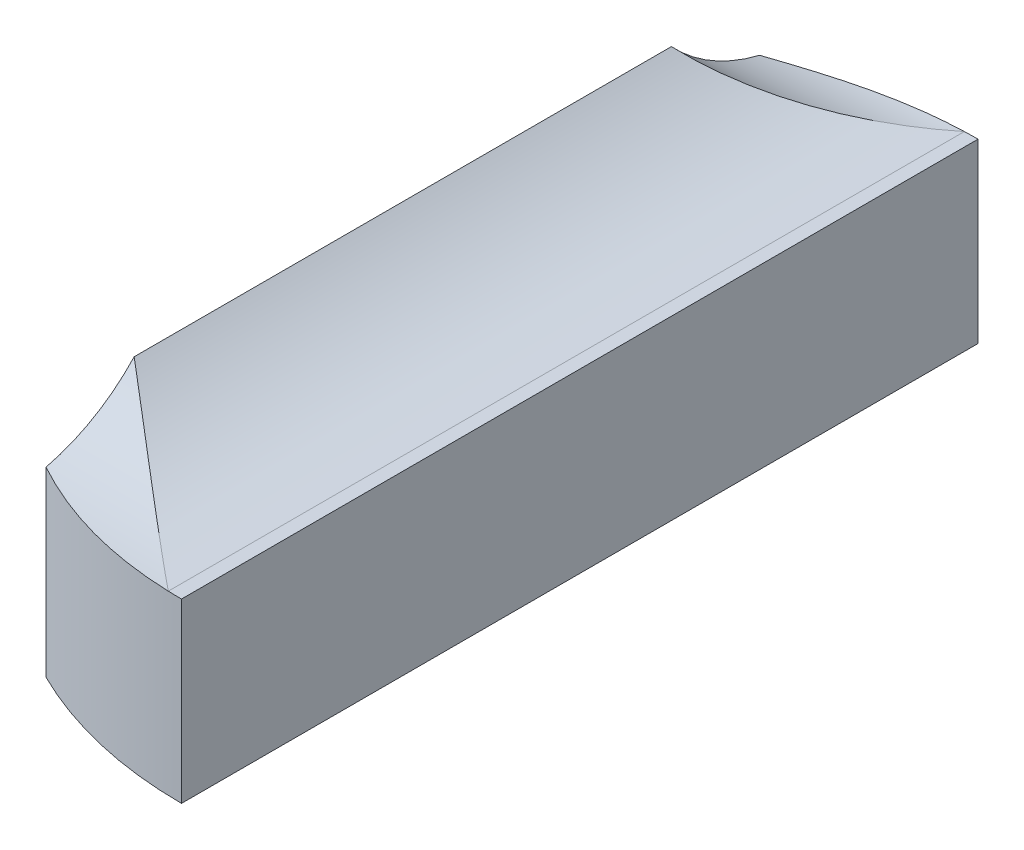
ISO-10303-21;
HEADER;
FILE_DESCRIPTION(('STEP AP214'),'2;1');
FILE_NAME('part.step','',(''),(''),'','','');
FILE_SCHEMA(('AUTOMOTIVE_DESIGN { 1 0 10303 214 1 1 1 1 }'));
ENDSEC;
DATA;
#1=APPLICATION_CONTEXT('core data for automotive mechanical design processes');
#2=APPLICATION_PROTOCOL_DEFINITION('international standard','automotive_design',2000,#1);
#3=PRODUCT_CONTEXT('',#1,'mechanical');
#4=PRODUCT('Part','Part','',(#3));
#5=PRODUCT_RELATED_PRODUCT_CATEGORY('part','',(#4));
#6=PRODUCT_DEFINITION_FORMATION('','',#4);
#7=PRODUCT_DEFINITION_CONTEXT('part definition',#1,'design');
#8=PRODUCT_DEFINITION('design','',#6,#7);
#9=PRODUCT_DEFINITION_SHAPE('','',#8);
#10=(LENGTH_UNIT() NAMED_UNIT(*) SI_UNIT(.MILLI.,.METRE.));
#11=(NAMED_UNIT(*) PLANE_ANGLE_UNIT() SI_UNIT($,.RADIAN.));
#12=(NAMED_UNIT(*) SI_UNIT($,.STERADIAN.) SOLID_ANGLE_UNIT());
#13=UNCERTAINTY_MEASURE_WITH_UNIT(LENGTH_MEASURE(1.E-05),#10,'distance_accuracy_value','');
#14=(GEOMETRIC_REPRESENTATION_CONTEXT(3) GLOBAL_UNCERTAINTY_ASSIGNED_CONTEXT((#13)) GLOBAL_UNIT_ASSIGNED_CONTEXT((#10,
#11,#12)) REPRESENTATION_CONTEXT('',''));
#15=CARTESIAN_POINT('',(0.,0.,0.));
#16=DIRECTION('',(0.,0.,1.));
#17=DIRECTION('',(1.,0.,0.));
#18=AXIS2_PLACEMENT_3D('',#15,#16,#17);
#19=CARTESIAN_POINT('',(0.,0.,0.));
#20=DIRECTION('',(0.,1.,0.));
#21=DIRECTION('',(1.,0.,0.));
#22=AXIS2_PLACEMENT_3D('',#19,#20,#21);
#23=CYLINDRICAL_SURFACE('',#22,28.575);
#24=CARTESIAN_POINT('',(-0.962642902411477,12.7000103571768,28.558780499917));
#25=CARTESIAN_POINT('',(-1.3607761503102,12.7000623405133,28.5453656938383));
#26=CARTESIAN_POINT('',(-1.75862825689124,12.7000777129765,28.5236151588992));
#27=CARTESIAN_POINT('',(-2.55307899623916,12.7004445435241,28.4635033904879));
#28=CARTESIAN_POINT('',(-2.94967761792786,12.7007960045706,28.4251420106218));
#29=CARTESIAN_POINT('',(-3.74118366921573,12.7022448100237,28.3318388404822));
#30=CARTESIAN_POINT('',(-4.13608981320455,12.7033426454376,28.2768861487445));
#31=CARTESIAN_POINT('',(-4.92324947447937,12.7069381444453,28.1505085427587));
#32=CARTESIAN_POINT('',(-5.31550300582261,12.7094358006151,28.0790837158735));
#33=CARTESIAN_POINT('',(-6.09971504116847,12.7166858056301,27.9192672118523));
#34=CARTESIAN_POINT('',(-6.49164726347514,12.7214556290704,27.8307472529649));
#35=CARTESIAN_POINT('',(-7.27137941730738,12.7342954372855,27.6372759368338));
#36=CARTESIAN_POINT('',(-7.65917937418716,12.7423654017996,27.5323246804693));
#37=CARTESIAN_POINT('',(-8.42975640725983,12.7630247664455,27.3062442784215));
#38=CARTESIAN_POINT('',(-8.81253540321093,12.7756123837614,27.1851215263719));
#39=CARTESIAN_POINT('',(-9.57240196747997,12.8067151018845,26.9269527073132));
#40=CARTESIAN_POINT('',(-9.94948990979667,12.8252298113894,26.7899076918606));
#41=CARTESIAN_POINT('',(-10.8728927575909,12.8802289715,26.4321390525996));
#42=CARTESIAN_POINT('',(-11.4154826552657,12.921069187127,26.2023507001288));
#43=CARTESIAN_POINT('',(-12.4837500266763,13.0247001334089,25.7105492113076));
#44=CARTESIAN_POINT('',(-13.0094275044079,13.0874908588779,25.4485360825706));
#45=CARTESIAN_POINT('',(-14.0386470858113,13.2413188734456,24.8955218171345));
#46=CARTESIAN_POINT('',(-14.5422624205993,13.3322531031989,24.6046290332782));
#47=CARTESIAN_POINT('',(-15.5253033019142,13.5496409172657,23.9964408297584));
#48=CARTESIAN_POINT('',(-16.0047377469772,13.6760813211805,23.6791552381827));
#49=CARTESIAN_POINT('',(-16.8002547898707,13.9292795839771,23.1180863962715));
#50=CARTESIAN_POINT('',(-17.123479171051,14.0453697562299,22.8795842100222));
#51=CARTESIAN_POINT('',(-17.7534814131752,14.302086936599,22.3942506229855));
#52=CARTESIAN_POINT('',(-18.0602635161131,14.4427075758021,22.1474213975547));
#53=CARTESIAN_POINT('',(-18.6552298763263,14.7509891906529,21.6486405827833));
#54=CARTESIAN_POINT('',(-18.9434257661055,14.9186330188448,21.3966923297248));
#55=CARTESIAN_POINT('',(-19.4993082019253,15.2832535267715,20.8913521403153));
#56=CARTESIAN_POINT('',(-19.7669984548309,15.4802248858398,20.6379604738347));
#57=CARTESIAN_POINT('',(-20.234127179903,15.8672649269102,20.1791498359509));
#58=CARTESIAN_POINT('',(-20.4372307457051,16.0523162460658,19.9732236603809));
#59=CARTESIAN_POINT('',(-20.8271119032828,16.4437967712395,19.5663328087745));
#60=CARTESIAN_POINT('',(-21.0138928922234,16.6502215092434,19.3653671066085));
#61=CARTESIAN_POINT('',(-21.3701713388694,17.0844581862883,18.9714767807794));
#62=CARTESIAN_POINT('',(-21.5396731298461,17.3122647355449,18.7785501482922));
#63=CARTESIAN_POINT('',(-21.8606787693192,17.7888329761919,18.4038644456918));
#64=CARTESIAN_POINT('',(-22.0121823832141,18.0375949406584,18.2221055211617));
#65=CARTESIAN_POINT('',(-22.2974382725321,18.5565357054144,17.871938576604));
#66=CARTESIAN_POINT('',(-22.4310835814292,18.826829320469,17.7036132443664));
#67=CARTESIAN_POINT('',(-22.6792372793652,19.386003606918,17.3845820904189));
#68=CARTESIAN_POINT('',(-22.7937450745918,19.6748848546775,17.2338768154801));
#69=CARTESIAN_POINT('',(-23.0034597025057,20.2691361978431,16.9529413254658));
#70=CARTESIAN_POINT('',(-23.0986674148253,20.5745055409741,16.8227101773097));
#71=CARTESIAN_POINT('',(-23.2697906025734,21.1992400080783,16.5852020755224));
#72=CARTESIAN_POINT('',(-23.3457083796059,21.5186034569901,16.4779223836493));
#73=CARTESIAN_POINT('',(-23.4701116509626,22.1280288861706,16.3001450750938));
#74=CARTESIAN_POINT('',(-23.5208356823848,22.4167889072298,16.2267309964581));
#75=CARTESIAN_POINT('',(-23.6076984467592,23.0008228742553,16.100096420912));
#76=CARTESIAN_POINT('',(-23.6438389597465,23.2960960205997,16.0468734595616));
#77=CARTESIAN_POINT('',(-23.7016972572096,23.8916760000383,15.9612926924242));
#78=CARTESIAN_POINT('',(-23.7233869802868,24.1919914725832,15.9289754861824));
#79=CARTESIAN_POINT('',(-23.7450719580124,24.6440955561163,15.8966136680399));
#80=CARTESIAN_POINT('',(-23.750492013807,24.7951042402366,15.8885120518578));
#81=CARTESIAN_POINT('',(-23.7577175691629,25.0974022821664,15.8777046290994));
#82=CARTESIAN_POINT('',(-23.7595230358051,25.2486916425196,15.8749988716645));
#83=CARTESIAN_POINT('',(-23.7595244060145,25.3999999989417,15.875));
#84=B_SPLINE_CURVE_WITH_KNOTS('',3,(#24,#25,#26,#27,#28,#29,#30,#31,#32,#33,#34,#35,#36,#37,#38,
#39,#40,#41,#42,#43,#44,#45,#46,#47,#48,#49,#50,#51,#52,#53,#54,#55,#56,#57,#58,#59,#60,#61,#62,
#63,#64,#65,#66,#67,#68,#69,#70,#71,#72,#73,#74,#75,#76,#77,#78,#79,#80,#81,#82,#83),
.UNSPECIFIED.,.F.,.F.,(4,2,2,2,2,2,2,2,2,2,2,2,2,2,2,2,2,2,2,2,2,2,2,2,2,2,2,2,2,4),(0.,
1.19499017100452,2.38999087385898,3.5857784773222,4.78155973885822,5.98668965465637,
7.19181217191533,8.39645962980384,9.60102757414408,11.3715014481909,13.1419749039514,
14.9060402358499,16.6694515852094,17.9228644913719,19.175952453501,20.4282483813565,
21.6803173910816,22.7094151795732,23.738298272619,24.7669227046649,25.7955605430896,
26.830107098786,27.8646857491629,28.8992172363451,29.9336252290117,30.8392539837847,
31.7447721658629,32.6520436511371,33.1058917455508,33.559743973259),.UNSPECIFIED.);
#85=CARTESIAN_POINT('',(-0.962642841912548,12.7000054003817,28.5587786987607));
#86=VERTEX_POINT('',#85);
#87=CARTESIAN_POINT('',(-12.7,13.0539279019213,25.5976683508479));
#88=VERTEX_POINT('',#87);
#89=EDGE_CURVE('E123',#86,#88,#84,.T.);
#90=ORIENTED_EDGE('',*,*,#89,.T.);
#91=DIRECTION('',(0.,1.,0.));
#92=VECTOR('',#91,1.);
#93=CARTESIAN_POINT('',(-12.7,0.,25.5976683508479));
#94=LINE('',#93,#92);
#95=CARTESIAN_POINT('',(-12.7,0.,25.5976683508479));
#96=VERTEX_POINT('',#95);
#97=EDGE_CURVE('E68',#88,#96,#94,.F.);
#98=ORIENTED_EDGE('',*,*,#97,.T.);
#99=CARTESIAN_POINT('',(0.,0.,0.));
#100=DIRECTION('',(0.,1.,0.));
#101=DIRECTION('',(1.,0.,0.));
#102=AXIS2_PLACEMENT_3D('',#99,#100,#101);
#103=CIRCLE('',#102,28.575);
#104=CARTESIAN_POINT('',(0.,0.,28.575));
#105=VERTEX_POINT('',#104);
#106=EDGE_CURVE('E257',#96,#105,#103,.T.);
#107=ORIENTED_EDGE('',*,*,#106,.T.);
#108=DIRECTION('',(0.,1.,0.));
#109=VECTOR('',#108,1.);
#110=CARTESIAN_POINT('',(0.,0.,28.575));
#111=LINE('',#110,#109);
#112=CARTESIAN_POINT('',(0.,12.7,28.575));
#113=VERTEX_POINT('',#112);
#114=EDGE_CURVE('E278',#105,#113,#111,.T.);
#115=ORIENTED_EDGE('',*,*,#114,.T.);
#116=CARTESIAN_POINT('',(0.,12.7,0.));
#117=DIRECTION('',(0.,1.,0.));
#118=DIRECTION('',(0.,0.,1.));
#119=AXIS2_PLACEMENT_3D('',#116,#117,#118);
#120=CIRCLE('',#119,28.575);
#121=EDGE_CURVE('E132',#86,#113,#120,.T.);
#122=ORIENTED_EDGE('',*,*,#121,.F.);
#123=EDGE_LOOP('',(#90,#98,#107,#115,#122));
#124=FACE_BOUND('',#123,.T.);
#125=ADVANCED_FACE('F49',(#124),#23,.T.);
#126=CARTESIAN_POINT('',(0.,0.,-28.575));
#127=VERTEX_POINT('',#126);
#128=CARTESIAN_POINT('',(-12.7,0.,-25.5976683508479));
#129=VERTEX_POINT('',#128);
#130=EDGE_CURVE('E246',#127,#129,#103,.T.);
#131=ORIENTED_EDGE('',*,*,#130,.T.);
#132=DIRECTION('',(0.,1.,0.));
#133=VECTOR('',#132,1.);
#134=CARTESIAN_POINT('',(-12.7,0.,-25.5976683508479));
#135=LINE('',#134,#133);
#136=CARTESIAN_POINT('',(-12.7,13.0539279019213,-25.5976683508479));
#137=VERTEX_POINT('',#136);
#138=EDGE_CURVE('E292',#129,#137,#135,.T.);
#139=ORIENTED_EDGE('',*,*,#138,.T.);
#140=CARTESIAN_POINT('',(-23.7595244060145,25.4,-15.875));
#141=CARTESIAN_POINT('',(-23.7595230142696,25.2487022879555,-15.8749989098196));
#142=CARTESIAN_POINT('',(-23.7577178144887,25.097423696676,-15.8777042643214));
#143=CARTESIAN_POINT('',(-23.7504933685242,24.7951497627849,-15.8885100236635));
#144=CARTESIAN_POINT('',(-23.7450742181246,24.6441544127726,-15.8966102855172));
#145=CARTESIAN_POINT('',(-23.7233910418275,24.1920527026428,-15.928969445265));
#146=CARTESIAN_POINT('',(-23.7017012979497,23.8917259405318,-15.9612867423953));
#147=CARTESIAN_POINT('',(-23.6438538220081,23.2962406822662,-16.0468514492215));
#148=CARTESIAN_POINT('',(-23.60772970318,23.0010718301604,-16.1000502272979));
#149=CARTESIAN_POINT('',(-23.5209125552445,22.4172670242057,-16.2266195506375));
#150=CARTESIAN_POINT('',(-23.4702195630698,22.1286310537976,-16.2999900447645));
#151=CARTESIAN_POINT('',(-23.3541507382645,21.5598874555803,-16.4658587292189));
#152=CARTESIAN_POINT('',(-23.288772385784,21.2797813007735,-16.558360202));
#153=CARTESIAN_POINT('',(-23.1432557401746,20.7300309154546,-16.7611425575633));
#154=CARTESIAN_POINT('',(-23.0631169883516,20.4603870103825,-16.871423992862));
#155=CARTESIAN_POINT('',(-22.8880672055159,19.9333086798498,-17.1081459159033));
#156=CARTESIAN_POINT('',(-22.7931576795388,19.6758730139405,-17.234584757088));
#157=CARTESIAN_POINT('',(-22.5886257001554,19.1746613085024,-17.5017972837089));
#158=CARTESIAN_POINT('',(-22.4790031380841,18.9308853698781,-17.6425710750161));
#159=CARTESIAN_POINT('',(-22.2432478358358,18.4542121469509,-17.9389237963665));
#160=CARTESIAN_POINT('',(-22.1168677311122,18.221567817231,-18.0947124536362));
#161=CARTESIAN_POINT('',(-21.84939700222,17.7726035131081,-18.4167934780995));
#162=CARTESIAN_POINT('',(-21.7083062998932,17.5562836254483,-18.5830859010984));
#163=CARTESIAN_POINT('',(-21.4118352417292,17.1405181441847,-18.9239253558157));
#164=CARTESIAN_POINT('',(-21.2564514168758,16.9410766697319,-19.0984743864364));
#165=CARTESIAN_POINT('',(-20.9319934414159,16.5593615405111,-19.4535374994589));
#166=CARTESIAN_POINT('',(-20.7629175798899,16.3770900374306,-19.6340523256567));
#167=CARTESIAN_POINT('',(-20.3949417420431,16.0130117574471,-20.0163410915228));
#168=CARTESIAN_POINT('',(-20.1947364163166,15.8329234693482,-20.2184945225331));
#169=CARTESIAN_POINT('',(-19.7797449846715,15.4928161677378,-20.624660800305));
#170=CARTESIAN_POINT('',(-19.5649582952595,15.3327979580889,-20.8286737211936));
#171=CARTESIAN_POINT('',(-19.1218490509949,15.0319651604038,-21.2361980526336));
#172=CARTESIAN_POINT('',(-18.8935245367295,14.8911533620119,-21.4397093861255));
#173=CARTESIAN_POINT('',(-18.4244445725137,14.6276369062662,-21.8441407384501));
#174=CARTESIAN_POINT('',(-18.1836865483087,14.5049360190785,-22.0450602098103));
#175=CARTESIAN_POINT('',(-17.546300866602,14.2093634427092,-22.5590272841069));
#176=CARTESIAN_POINT('',(-17.1410320137767,14.0492437570611,-22.8687645018517));
#177=CARTESIAN_POINT('',(-16.3059237756883,13.7657514987049,-23.4715381382959));
#178=CARTESIAN_POINT('',(-15.8760727075008,13.6423965747109,-23.7645664815896));
#179=CARTESIAN_POINT('',(-14.9942917455854,13.4264082227125,-24.3305798520018));
#180=CARTESIAN_POINT('',(-14.5423037935466,13.3338611557759,-24.6035068926997));
#181=CARTESIAN_POINT('',(-13.6205016758979,13.1743795036521,-25.1255478749963));
#182=CARTESIAN_POINT('',(-13.1506880067271,13.1074442057617,-25.3746624790831));
#183=CARTESIAN_POINT('',(-12.3409075205042,13.0112668771474,-25.7753823241447));
#184=CARTESIAN_POINT('',(-12.0048116040627,12.9767505730975,-25.9336338272669));
#185=CARTESIAN_POINT('',(-11.3260407943873,12.9160676090905,-26.2371801050202));
#186=CARTESIAN_POINT('',(-10.9833653839623,12.8899016083939,-26.3824738559783));
#187=CARTESIAN_POINT('',(-10.2920973648775,12.8444615573761,-26.6597469200507));
#188=CARTESIAN_POINT('',(-9.94350278078425,12.8251898572321,-26.7917216819107));
#189=CARTESIAN_POINT('',(-9.24114312836667,12.7922281061876,-27.0420210947388));
#190=CARTESIAN_POINT('',(-8.88737742413847,12.778538747844,-27.1603440507308));
#191=CARTESIAN_POINT('',(-8.17565205441353,12.7555691463201,-27.3829921609563));
#192=CARTESIAN_POINT('',(-7.81769608375231,12.7462852804137,-27.48732876561));
#193=CARTESIAN_POINT('',(-7.09795058785473,12.7310643122888,-27.6819197734936));
#194=CARTESIAN_POINT('',(-6.73616148459517,12.7251268454974,-27.7721757099638));
#195=CARTESIAN_POINT('',(-6.00945071830102,12.7156903730339,-27.9384325221616));
#196=CARTESIAN_POINT('',(-5.64453040015585,12.7121903687873,-28.0144392261471));
#197=CARTESIAN_POINT('',(-4.91201706543628,12.7068554673417,-28.1521149285236));
#198=CARTESIAN_POINT('',(-4.5444243304264,12.7050203972173,-28.2137854154262));
#199=CARTESIAN_POINT('',(-3.90933177712482,12.7027547616586,-28.307601461938));
#200=CARTESIAN_POINT('',(-3.64233615137219,12.7020758584111,-28.3431923928319));
#201=CARTESIAN_POINT('',(-3.10749045893204,12.7010739652823,-28.4068062039456));
#202=CARTESIAN_POINT('',(-2.83964055721095,12.7007509104176,-28.434830465247));
#203=CARTESIAN_POINT('',(-2.30386477833455,12.7003079880903,-28.4832409466461));
#204=CARTESIAN_POINT('',(-2.03594045219978,12.7001876613143,-28.5036443511115));
#205=CARTESIAN_POINT('',(-1.49960116382666,12.7000482247045,-28.5368890044274));
#206=CARTESIAN_POINT('',(-1.23118616348838,12.7000291230963,-28.5497296386428));
#207=CARTESIAN_POINT('',(-0.962642969131848,12.7000103571797,-28.558780497668));
#208=B_SPLINE_CURVE_WITH_KNOTS('',3,(#140,#141,#142,#143,#144,#145,#146,#147,#148,#149,#150,
#151,#152,#153,#154,#155,#156,#157,#158,#159,#160,#161,#162,#163,#164,#165,#166,#167,#168,#169,
#170,#171,#172,#173,#174,#175,#176,#177,#178,#179,#180,#181,#182,#183,#184,#185,#186,#187,#188,
#189,#190,#191,#192,#193,#194,#195,#196,#197,#198,#199,#200,#201,#202,#203,#204,#205,#206,#207),
.UNSPECIFIED.,.F.,.F.,(4,2,2,2,2,2,2,2,2,2,2,2,2,2,2,2,2,2,2,2,2,2,2,2,2,2,2,2,2,2,2,2,2,4),(0.,
0.45382005249023,0.907628077419532,1.81493094946456,2.72013319097462,3.62533313778105,
4.53068852596952,5.43607205372104,6.34136338974141,7.24666141228281,8.16723436228149,
9.0878122035875,10.008614066494,10.9295311683503,11.9387019412507,12.9479131213493,
13.9572707290704,14.9668381603044,16.5681964302884,18.1703221895733,19.7769019591028,
21.3834370188055,22.5023491187585,23.6213495355191,24.7407310422484,25.8602513795385,
26.9788495102599,28.0973257519681,29.2153435087105,30.3332451311608,31.1412193467503,
31.9490459896379,32.7550398963778,33.5610992981407),.UNSPECIFIED.);
#209=CARTESIAN_POINT('',(-0.962642908593872,12.7000054003861,-28.5587786953534));
#210=VERTEX_POINT('',#209);
#211=EDGE_CURVE('E54',#137,#210,#208,.T.);
#212=ORIENTED_EDGE('',*,*,#211,.T.);
#213=CARTESIAN_POINT('',(0.,12.7,0.));
#214=DIRECTION('',(0.,1.,0.));
#215=DIRECTION('',(0.0333333333333333,0.,-0.999444290037663));
#216=AXIS2_PLACEMENT_3D('',#213,#214,#215);
#217=CIRCLE('',#216,28.575);
#218=CARTESIAN_POINT('',(0.,12.7,-28.575));
#219=VERTEX_POINT('',#218);
#220=EDGE_CURVE('E227',#219,#210,#217,.T.);
#221=ORIENTED_EDGE('',*,*,#220,.F.);
#222=DIRECTION('',(0.,1.,0.));
#223=VECTOR('',#222,1.);
#224=CARTESIAN_POINT('',(0.,0.,-28.575));
#225=LINE('',#224,#223);
#226=EDGE_CURVE('E76',#219,#127,#225,.F.);
#227=ORIENTED_EDGE('',*,*,#226,.T.);
#228=EDGE_LOOP('',(#131,#139,#212,#221,#227));
#229=FACE_BOUND('',#228,.T.);
#230=ADVANCED_FACE('F166',(#229),#23,.T.);
#231=CARTESIAN_POINT('',(0.,0.,0.));
#232=DIRECTION('',(0.,1.,0.));
#233=DIRECTION('',(1.,0.,0.));
#234=AXIS2_PLACEMENT_3D('',#231,#232,#233);
#235=PLANE('',#234);
#236=DIRECTION('',(0.,0.,1.));
#237=VECTOR('',#236,1.);
#238=CARTESIAN_POINT('',(-12.7,0.,0.));
#239=LINE('',#238,#237);
#240=EDGE_CURVE('E282',#129,#96,#239,.T.);
#241=ORIENTED_EDGE('',*,*,#240,.F.);
#242=ORIENTED_EDGE('',*,*,#130,.F.);
#243=DIRECTION('',(0.,0.,-1.));
#244=VECTOR('',#243,1.);
#245=CARTESIAN_POINT('',(0.,0.,0.));
#246=LINE('',#245,#244);
#247=EDGE_CURVE('E258',#105,#127,#246,.T.);
#248=ORIENTED_EDGE('',*,*,#247,.F.);
#249=ORIENTED_EDGE('',*,*,#106,.F.);
#250=EDGE_LOOP('',(#241,#242,#248,#249));
#251=FACE_BOUND('',#250,.T.);
#252=ADVANCED_FACE('F163',(#251),#235,.F.);
#253=CARTESIAN_POINT('',(-31.75,25.4,-28.575));
#254=DIRECTION('',(-1.,0.,0.));
#255=DIRECTION('',(0.,0.,1.));
#256=AXIS2_PLACEMENT_3D('',#253,#254,#255);
#257=CYLINDRICAL_SURFACE('',#256,12.7);
#258=CARTESIAN_POINT('',(-12.7,25.4,-28.575));
#259=DIRECTION('',(-1.,0.,0.));
#260=DIRECTION('',(0.,0.,1.));
#261=AXIS2_PLACEMENT_3D('',#258,#259,#260);
#262=CIRCLE('',#261,12.7);
#263=CARTESIAN_POINT('',(-12.6999998688532,16.7536969355882,-19.2730560022782));
#264=VERTEX_POINT('',#263);
#265=EDGE_CURVE('E120',#264,#137,#262,.F.);
#266=ORIENTED_EDGE('',*,*,#265,.F.);
#267=CARTESIAN_POINT('',(-12.699684634162,16.7537714435414,-19.2727028778113));
#268=CARTESIAN_POINT('',(-12.3836806892202,16.506088003812,-19.5029369849453));
#269=CARTESIAN_POINT('',(-12.0631276320647,16.2708258158363,-19.740019879616));
#270=CARTESIAN_POINT('',(-11.5639839389283,15.9277502211339,-20.1134424080059));
#271=CARTESIAN_POINT('',(-11.3882590904614,15.8112896163813,-20.245696727826));
#272=CARTESIAN_POINT('',(-11.08359925319,15.6166122087625,-20.4761516195648));
#273=CARTESIAN_POINT('',(-10.9551822761382,15.5367354978665,-20.5736407420555));
#274=CARTESIAN_POINT('',(-10.5447119945893,15.2881603699946,-20.8863215254293));
#275=CARTESIAN_POINT('',(-10.2606631014532,15.126197821286,-21.1042917266614));
#276=CARTESIAN_POINT('',(-9.6713628717489,14.8096186345226,-21.5596424136556));
#277=CARTESIAN_POINT('',(-9.36586019121766,14.6560221217158,-21.7974037510354));
#278=CARTESIAN_POINT('',(-8.73360636102458,14.3587532551662,-22.292571753746));
#279=CARTESIAN_POINT('',(-8.40663260244294,14.2161374415639,-22.5503279207361));
#280=CARTESIAN_POINT('',(-7.73137499137825,13.9435890227766,-23.0854085285839));
#281=CARTESIAN_POINT('',(-7.38289156077669,13.8147525746859,-23.3630393889773));
#282=CARTESIAN_POINT('',(-6.75454875098659,13.6028975524019,-23.8657891269545));
#283=CARTESIAN_POINT('',(-6.47528489409064,13.5159024109909,-24.0899903003336));
#284=CARTESIAN_POINT('',(-5.89096423211617,13.348719637455,-24.5595329612772));
#285=CARTESIAN_POINT('',(-5.58571737443059,13.2697238130165,-24.8050635231076));
#286=CARTESIAN_POINT('',(-4.98598800329354,13.1300888346779,-25.2886649301594));
#287=CARTESIAN_POINT('',(-4.69156772404133,13.06883795313,-25.5266373808312));
#288=CARTESIAN_POINT('',(-4.05984371484363,12.9526938220151,-26.0386757716107));
#289=CARTESIAN_POINT('',(-3.72240046006743,12.8999461251724,-26.3130582776466));
#290=CARTESIAN_POINT('',(-3.00458811466057,12.8073052266512,-26.8980121654646));
#291=CARTESIAN_POINT('',(-2.62410927422767,12.769832579181,-27.2088328888723));
#292=CARTESIAN_POINT('',(-1.82017453398208,12.7150593325947,-27.865953590917));
#293=CARTESIAN_POINT('',(-1.39662761295458,12.7004537211182,-28.2123689700488));
#294=CARTESIAN_POINT('',(-0.972785683816289,12.7000108007634,-28.558436809695));
#295=B_SPLINE_CURVE_WITH_KNOTS('',3,(#267,#268,#269,#270,#271,#272,#273,#274,#275,#276,#277,
#278,#279,#280,#281,#282,#283,#284,#285,#286,#287,#288,#289,#290,#291,#292,#293,#294),
.UNSPECIFIED.,.F.,.F.,(4,2,2,2,2,2,2,2,2,2,2,2,2,4),(0.,1.38801971648801,2.13448376398877,
2.67424208685006,3.85267117786556,5.10164331111535,6.42143419378378,7.81227726068816,
8.91765256610333,10.1161958012956,11.2664127340383,12.5803333273447,14.0579667931028,
15.6993161561724),.UNSPECIFIED.);
#296=EDGE_CURVE('E118',#264,#210,#295,.T.);
#297=ORIENTED_EDGE('',*,*,#296,.T.);
#298=ORIENTED_EDGE('',*,*,#211,.F.);
#299=EDGE_LOOP('',(#266,#297,#298));
#300=FACE_BOUND('',#299,.T.);
#301=ADVANCED_FACE('F51',(#300),#257,.F.);
#302=CARTESIAN_POINT('',(-0.9525,31.75,103.07574));
#303=DIRECTION('',(0.,0.,-1.));
#304=DIRECTION('',(0.,-1.,0.));
#305=AXIS2_PLACEMENT_3D('',#302,#303,#304);
#306=CYLINDRICAL_SURFACE('',#305,19.05);
#307=DIRECTION('',(0.,0.,-1.));
#308=VECTOR('',#307,1.);
#309=CARTESIAN_POINT('',(-12.7,16.7533755881532,103.07574));
#310=LINE('',#309,#308);
#311=CARTESIAN_POINT('',(-12.7,16.7533755881532,19.2730708301743));
#312=VERTEX_POINT('',#311);
#313=EDGE_CURVE('E105',#312,#264,#310,.T.);
#314=ORIENTED_EDGE('',*,*,#313,.F.);
#315=CARTESIAN_POINT('',(-18.9130122421383,25.4,15.875));
#316=CARTESIAN_POINT('',(-18.8497340693018,25.2210118693997,15.8749983411045));
#317=CARTESIAN_POINT('',(-18.7837855333039,25.0430075911527,15.8787844217914));
#318=CARTESIAN_POINT('',(-18.6467231259065,24.6893406660285,15.8936640856254));
#319=CARTESIAN_POINT('',(-18.5756101250626,24.5136776303775,15.9047564397118));
#320=CARTESIAN_POINT('',(-18.3550106585534,23.991278727185,15.9485421390167));
#321=CARTESIAN_POINT('',(-18.1980420811135,23.6485070556184,15.9917460206988));
#322=CARTESIAN_POINT('',(-17.8676527463349,22.9797135216138,16.1031892911451));
#323=CARTESIAN_POINT('',(-17.6944137433812,22.6535576652485,16.1711719752605));
#324=CARTESIAN_POINT('',(-17.3318691136895,22.01586555251,16.3297706721651));
#325=CARTESIAN_POINT('',(-17.1425559450336,21.7043362664966,16.4203973485763));
#326=CARTESIAN_POINT('',(-16.7049293713447,21.0280349659102,16.6447801029816));
#327=CARTESIAN_POINT('',(-16.4529997706711,20.6673005932043,16.7836581871037));
#328=CARTESIAN_POINT('',(-15.9308011524718,19.9711007243284,17.0875550697262));
#329=CARTESIAN_POINT('',(-15.6605297441538,19.6356385343733,17.2525772797803));
#330=CARTESIAN_POINT('',(-15.1032750036858,18.989084751423,17.6056610309178));
#331=CARTESIAN_POINT('',(-14.8162274474123,18.6780991821814,17.7938146310689));
#332=CARTESIAN_POINT('',(-14.2288791960802,18.0819567006576,18.189230718099));
#333=CARTESIAN_POINT('',(-13.9285774483285,17.7968018454491,18.3964947242207));
#334=CARTESIAN_POINT('',(-13.1984156246132,17.1464796343369,18.9105581416618));
#335=CARTESIAN_POINT('',(-12.7633697885075,16.7930239111386,19.2248493942131));
#336=CARTESIAN_POINT('',(-11.8763082571562,16.1333859449065,19.8781349126605));
#337=CARTESIAN_POINT('',(-11.4242863569987,15.8272212003951,20.2171382545109));
#338=CARTESIAN_POINT('',(-10.5065380825637,15.2601831655952,20.9149476019626));
#339=CARTESIAN_POINT('',(-10.0407984921444,14.9993553427282,21.2737730169768));
#340=CARTESIAN_POINT('',(-9.09905108543925,14.5216811645559,22.0066302810007));
#341=CARTESIAN_POINT('',(-8.62304394915615,14.304831906457,22.3806611244225));
#342=CARTESIAN_POINT('',(-7.55969097350217,13.8713976005961,23.222326626343));
#343=CARTESIAN_POINT('',(-6.97044213906647,13.6649246374295,23.6927739133145));
#344=CARTESIAN_POINT('',(-5.78364541772904,13.312379689528,24.6459168261099));
#345=CARTESIAN_POINT('',(-5.18609478958904,13.1663281705537,25.1286165433765));
#346=CARTESIAN_POINT('',(-3.98717431390972,12.9333741588415,26.1006321479538));
#347=CARTESIAN_POINT('',(-3.38581552424748,12.8463443988912,26.5899314644817));
#348=CARTESIAN_POINT('',(-2.18085829712548,12.7300198955487,27.5720588304996));
#349=CARTESIAN_POINT('',(-1.57726149500966,12.7006890890866,28.064884482488));
#350=CARTESIAN_POINT('',(-0.966754793001582,12.7000040018608,28.5633610103794));
#351=CARTESIAN_POINT('',(-0.95962738006711,12.7000000019469,28.5691805186742));
#352=CARTESIAN_POINT('',(-0.9525,12.7,28.575));
#353=B_SPLINE_CURVE_WITH_KNOTS('',3,(#315,#316,#317,#318,#319,#320,#321,#322,#323,#324,#325,
#326,#327,#328,#329,#330,#331,#332,#333,#334,#335,#336,#337,#338,#339,#340,#341,#342,#343,#344,
#345,#346,#347,#348,#349,#350,#351,#352),.UNSPECIFIED.,.F.,.F.,(4,2,2,2,2,2,2,2,2,2,2,2,2,2,2,2,
2,2,4),(0.,0.569405310393191,1.13871485992012,2.27535004648464,3.40052983933086,
4.52624050947126,5.9083905584972,7.29072111341501,8.6787429283433,10.0668751837947,
11.9919097522487,13.917654920933,15.8453203726628,17.7728585478994,20.115464646911,
22.4588635776714,24.7971932887953,27.1340610293043,27.1616653793962),.UNSPECIFIED.);
#354=EDGE_CURVE('E115',#312,#86,#353,.T.);
#355=ORIENTED_EDGE('',*,*,#354,.T.);
#356=DIRECTION('',(0.,0.,-1.));
#357=VECTOR('',#356,1.);
#358=CARTESIAN_POINT('',(-0.9525,12.7,103.07574));
#359=LINE('',#358,#357);
#360=EDGE_CURVE('E126',#86,#210,#359,.T.);
#361=ORIENTED_EDGE('',*,*,#360,.T.);
#362=ORIENTED_EDGE('',*,*,#296,.F.);
#363=EDGE_LOOP('',(#314,#355,#361,#362));
#364=FACE_BOUND('',#363,.T.);
#365=ADVANCED_FACE('F113',(#364),#306,.F.);
#366=CARTESIAN_POINT('',(-31.75,25.4,28.575));
#367=DIRECTION('',(1.,0.,0.));
#368=DIRECTION('',(0.,0.,-1.));
#369=AXIS2_PLACEMENT_3D('',#366,#367,#368);
#370=CYLINDRICAL_SURFACE('',#369,12.7);
#371=CARTESIAN_POINT('',(-12.7,25.4,28.575));
#372=DIRECTION('',(-1.,0.,0.));
#373=DIRECTION('',(0.,0.,1.));
#374=AXIS2_PLACEMENT_3D('',#371,#372,#373);
#375=CIRCLE('',#374,12.7);
#376=EDGE_CURVE('E13',#88,#312,#375,.F.);
#377=ORIENTED_EDGE('',*,*,#376,.F.);
#378=ORIENTED_EDGE('',*,*,#89,.F.);
#379=ORIENTED_EDGE('',*,*,#354,.F.);
#380=EDGE_LOOP('',(#377,#378,#379));
#381=FACE_BOUND('',#380,.T.);
#382=ADVANCED_FACE('F122',(#381),#370,.F.);
#383=CARTESIAN_POINT('',(-20.0025,12.7,-31.75));
#384=DIRECTION('',(0.,-1.,0.));
#385=DIRECTION('',(1.,0.,0.));
#386=AXIS2_PLACEMENT_3D('',#383,#384,#385);
#387=PLANE('',#386);
#388=DIRECTION('',(0.,0.,1.));
#389=VECTOR('',#388,1.);
#390=CARTESIAN_POINT('',(0.,12.7,-31.75));
#391=LINE('',#390,#389);
#392=EDGE_CURVE('E61',#219,#113,#391,.T.);
#393=ORIENTED_EDGE('',*,*,#392,.F.);
#394=ORIENTED_EDGE('',*,*,#220,.T.);
#395=ORIENTED_EDGE('',*,*,#360,.F.);
#396=ORIENTED_EDGE('',*,*,#121,.T.);
#397=EDGE_LOOP('',(#393,#394,#395,#396));
#398=FACE_BOUND('',#397,.T.);
#399=ADVANCED_FACE('F160',(#398),#387,.F.);
#400=CARTESIAN_POINT('',(0.,0.,0.));
#401=DIRECTION('',(1.,0.,0.));
#402=DIRECTION('',(0.,0.,-1.));
#403=AXIS2_PLACEMENT_3D('',#400,#401,#402);
#404=PLANE('',#403);
#405=ORIENTED_EDGE('',*,*,#247,.T.);
#406=ORIENTED_EDGE('',*,*,#226,.F.);
#407=ORIENTED_EDGE('',*,*,#392,.T.);
#408=ORIENTED_EDGE('',*,*,#114,.F.);
#409=EDGE_LOOP('',(#405,#406,#407,#408));
#410=FACE_BOUND('',#409,.T.);
#411=ADVANCED_FACE('F161',(#410),#404,.T.);
#412=CARTESIAN_POINT('',(-12.7,0.,0.));
#413=DIRECTION('',(-1.,0.,0.));
#414=DIRECTION('',(0.,0.,1.));
#415=AXIS2_PLACEMENT_3D('',#412,#413,#414);
#416=PLANE('',#415);
#417=ORIENTED_EDGE('',*,*,#240,.T.);
#418=ORIENTED_EDGE('',*,*,#97,.F.);
#419=ORIENTED_EDGE('',*,*,#376,.T.);
#420=ORIENTED_EDGE('',*,*,#313,.T.);
#421=ORIENTED_EDGE('',*,*,#265,.T.);
#422=ORIENTED_EDGE('',*,*,#138,.F.);
#423=EDGE_LOOP('',(#417,#418,#419,#420,#421,#422));
#424=FACE_BOUND('',#423,.T.);
#425=ADVANCED_FACE('F104',(#424),#416,.T.);
#426=CLOSED_SHELL('',(#125,#230,#252,#301,#365,#382,#399,#411,#425));
#427=MANIFOLD_SOLID_BREP('B2',#426);
#428=ADVANCED_BREP_SHAPE_REPRESENTATION('',(#18,#427),#14);
#429=SHAPE_DEFINITION_REPRESENTATION(#9,#428);
ENDSEC;
END-ISO-10303-21;
